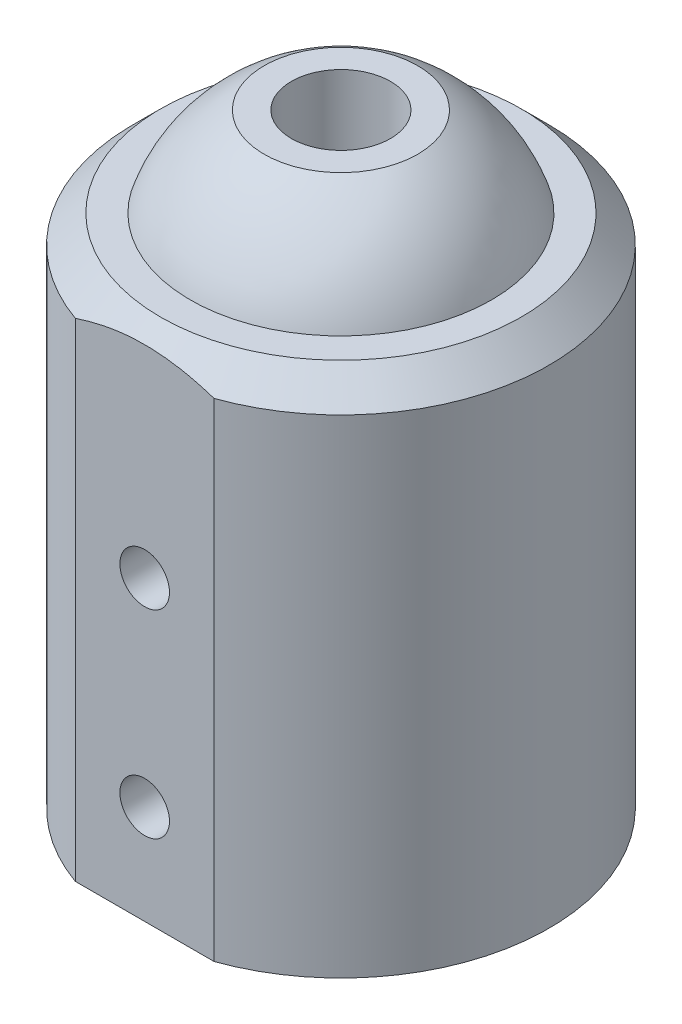
ISO-10303-21;
HEADER;
FILE_DESCRIPTION(('STEP AP214'),'2;1');
FILE_NAME('part.step','',(''),(''),'','','');
FILE_SCHEMA(('AUTOMOTIVE_DESIGN { 1 0 10303 214 1 1 1 1 }'));
ENDSEC;
DATA;
#1=APPLICATION_CONTEXT('core data for automotive mechanical design processes');
#2=APPLICATION_PROTOCOL_DEFINITION('international standard','automotive_design',2000,#1);
#3=PRODUCT_CONTEXT('',#1,'mechanical');
#4=PRODUCT('Part','Part','',(#3));
#5=PRODUCT_RELATED_PRODUCT_CATEGORY('part','',(#4));
#6=PRODUCT_DEFINITION_FORMATION('','',#4);
#7=PRODUCT_DEFINITION_CONTEXT('part definition',#1,'design');
#8=PRODUCT_DEFINITION('design','',#6,#7);
#9=PRODUCT_DEFINITION_SHAPE('','',#8);
#10=(LENGTH_UNIT() NAMED_UNIT(*) SI_UNIT(.MILLI.,.METRE.));
#11=(NAMED_UNIT(*) PLANE_ANGLE_UNIT() SI_UNIT($,.RADIAN.));
#12=(NAMED_UNIT(*) SI_UNIT($,.STERADIAN.) SOLID_ANGLE_UNIT());
#13=UNCERTAINTY_MEASURE_WITH_UNIT(LENGTH_MEASURE(1.E-05),#10,'distance_accuracy_value','');
#14=(GEOMETRIC_REPRESENTATION_CONTEXT(3) GLOBAL_UNCERTAINTY_ASSIGNED_CONTEXT((#13)) GLOBAL_UNIT_ASSIGNED_CONTEXT((#10,
#11,#12)) REPRESENTATION_CONTEXT('',''));
#15=CARTESIAN_POINT('',(0.,0.,0.));
#16=DIRECTION('',(0.,0.,1.));
#17=DIRECTION('',(1.,0.,0.));
#18=AXIS2_PLACEMENT_3D('',#15,#16,#17);
#19=CARTESIAN_POINT('',(0.,33.5828427942722,0.));
#20=DIRECTION('',(0.,1.,0.));
#21=DIRECTION('',(0.,0.,1.));
#22=AXIS2_PLACEMENT_3D('',#19,#20,#21);
#23=CYLINDRICAL_SURFACE('',#22,10.5);
#24=DIRECTION('',(0.,-1.,0.));
#25=VECTOR('',#24,1.);
#26=CARTESIAN_POINT('',(3.4985711369072,45.,9.9));
#27=LINE('',#26,#25);
#28=CARTESIAN_POINT('',(3.4985711369072,24.5993420767853,9.9));
#29=VERTEX_POINT('',#28);
#30=CARTESIAN_POINT('',(3.4985711369072,0.,9.9));
#31=VERTEX_POINT('',#30);
#32=EDGE_CURVE('E61',#29,#31,#27,.T.);
#33=ORIENTED_EDGE('',*,*,#32,.T.);
#34=CARTESIAN_POINT('',(0.,0.,0.));
#35=DIRECTION('',(0.,1.,0.));
#36=DIRECTION('',(0.,0.,1.));
#37=AXIS2_PLACEMENT_3D('',#34,#35,#36);
#38=CIRCLE('',#37,10.5);
#39=CARTESIAN_POINT('',(-3.4985711369072,0.,9.9));
#40=VERTEX_POINT('',#39);
#41=EDGE_CURVE('E76',#31,#40,#38,.T.);
#42=ORIENTED_EDGE('',*,*,#41,.T.);
#43=DIRECTION('',(0.,-1.,0.));
#44=VECTOR('',#43,1.);
#45=CARTESIAN_POINT('',(-3.4985711369072,45.,9.9));
#46=LINE('',#45,#44);
#47=CARTESIAN_POINT('',(-3.4985711369072,24.5993420767853,9.9));
#48=VERTEX_POINT('',#47);
#49=EDGE_CURVE('E56',#48,#40,#46,.T.);
#50=ORIENTED_EDGE('',*,*,#49,.F.);
#51=CARTESIAN_POINT('',(0.,24.5993420767853,0.));
#52=DIRECTION('',(0.,1.,0.));
#53=DIRECTION('',(0.,0.,1.));
#54=AXIS2_PLACEMENT_3D('',#51,#52,#53);
#55=CIRCLE('',#54,10.5);
#56=EDGE_CURVE('E11',#29,#48,#55,.T.);
#57=ORIENTED_EDGE('',*,*,#56,.F.);
#58=EDGE_LOOP('',(#33,#42,#50,#57));
#59=FACE_BOUND('',#58,.T.);
#60=ADVANCED_FACE('F41',(#59),#23,.T.);
#61=CARTESIAN_POINT('',(0.,24.5993420767853,0.));
#62=DIRECTION('',(0.,-1.,0.));
#63=DIRECTION('',(0.,0.,-1.));
#64=AXIS2_PLACEMENT_3D('',#61,#62,#63);
#65=CONICAL_SURFACE('',#64,10.5,0.785398163397453);
#66=CARTESIAN_POINT('',(0.,26.,0.));
#67=DIRECTION('',(0.,1.,0.));
#68=DIRECTION('',(0.,0.,1.));
#69=AXIS2_PLACEMENT_3D('',#66,#67,#68);
#70=CIRCLE('',#69,9.09934207678533);
#71=CARTESIAN_POINT('',(0.,26.,9.09934207678533));
#72=VERTEX_POINT('',#71);
#73=EDGE_CURVE('E49',#72,#72,#70,.T.);
#74=ORIENTED_EDGE('',*,*,#73,.F.);
#75=EDGE_LOOP('',(#74));
#76=FACE_BOUND('',#75,.T.);
#77=CARTESIAN_POINT('',(10.6347253560614,20.5698072115925,9.9));
#78=CARTESIAN_POINT('',(10.3534327245152,20.7756370171556,9.9));
#79=CARTESIAN_POINT('',(10.0703640832947,20.9790886058814,9.9));
#80=CARTESIAN_POINT('',(9.49994449108002,21.3801096104111,9.9));
#81=CARTESIAN_POINT('',(9.21259204206175,21.5776768924951,9.9));
#82=CARTESIAN_POINT('',(8.62992895484494,21.9677607024612,9.9));
#83=CARTESIAN_POINT('',(8.33456578398147,22.1601990946641,9.9));
#84=CARTESIAN_POINT('',(7.73818145145608,22.5360694148431,9.9));
#85=CARTESIAN_POINT('',(7.43716083203955,22.7195021999469,9.9));
#86=CARTESIAN_POINT('',(6.81469406083715,23.0833782446129,9.9));
#87=CARTESIAN_POINT('',(6.49294277694404,23.2633028011417,9.9));
#88=CARTESIAN_POINT('',(5.84122694862456,23.6078923575283,9.9));
#89=CARTESIAN_POINT('',(5.51126082511532,23.7725543943925,9.9));
#90=CARTESIAN_POINT('',(4.8437397246116,24.0818679774736,9.9));
#91=CARTESIAN_POINT('',(4.50622415814122,24.2266037290523,9.9));
#92=CARTESIAN_POINT('',(3.82186202173466,24.4919263438985,9.9));
#93=CARTESIAN_POINT('',(3.47501949477547,24.6125234851075,9.9));
#94=CARTESIAN_POINT('',(2.79385250281583,24.8174746471964,9.9));
#95=CARTESIAN_POINT('',(2.4600683586249,24.9036003087884,9.9));
#96=CARTESIAN_POINT('',(1.78586267617628,25.0449497638404,9.9));
#97=CARTESIAN_POINT('',(1.44544055245254,25.100170818657,9.9));
#98=CARTESIAN_POINT('',(0.766481206723811,25.1753468762649,9.9));
#99=CARTESIAN_POINT('',(0.428009473572112,25.1958825052144,9.9));
#100=CARTESIAN_POINT('',(-0.249245485116191,25.2019946809104,9.9));
#101=CARTESIAN_POINT('',(-0.588028698156881,25.1875725737329,9.9));
#102=CARTESIAN_POINT('',(-1.26129292288764,25.1249357300161,9.9));
#103=CARTESIAN_POINT('',(-1.59578424604384,25.0768294931369,9.9));
#104=CARTESIAN_POINT('',(-2.25889352555743,24.9501283914096,9.9));
#105=CARTESIAN_POINT('',(-2.58751044315523,24.8715281890833,9.9));
#106=CARTESIAN_POINT('',(-3.24258465072016,24.6866622865256,9.9));
#107=CARTESIAN_POINT('',(-3.56891784814667,24.5799634507927,9.9));
#108=CARTESIAN_POINT('',(-4.21331233486015,24.3442499311886,9.9));
#109=CARTESIAN_POINT('',(-4.53137380686518,24.2152357407344,9.9));
#110=CARTESIAN_POINT('',(-5.10960524225863,23.9610401127193,9.9));
#111=CARTESIAN_POINT('',(-5.37095090644008,23.8385006629271,9.9));
#112=CARTESIAN_POINT('',(-5.88838236354608,23.5827256500491,9.9));
#113=CARTESIAN_POINT('',(-6.14446735015625,23.4494884624364,9.9));
#114=CARTESIAN_POINT('',(-6.65207092220755,23.1739673421567,9.9));
#115=CARTESIAN_POINT('',(-6.90358406574976,23.0316734335521,9.9));
#116=CARTESIAN_POINT('',(-7.40224875665219,22.7396315576672,9.9));
#117=CARTESIAN_POINT('',(-7.64940005651858,22.589883169245,9.9));
#118=CARTESIAN_POINT('',(-8.12952153510164,22.290540747204,9.9));
#119=CARTESIAN_POINT('',(-8.36265205312506,22.1412030478821,9.9));
#120=CARTESIAN_POINT('',(-8.82571597270232,21.8376413771605,9.9));
#121=CARTESIAN_POINT('',(-9.05564925485527,21.6834172239775,9.9));
#122=CARTESIAN_POINT('',(-9.5119045120272,21.3713163542598,9.9));
#123=CARTESIAN_POINT('',(-9.73823589395235,21.2134533563395,9.9));
#124=CARTESIAN_POINT('',(-10.1883264619794,20.8941666084075,9.9));
#125=CARTESIAN_POINT('',(-10.4120860106608,20.7327433699254,9.9));
#126=CARTESIAN_POINT('',(-10.6347253560614,20.5698072115925,9.9));
#127=B_SPLINE_CURVE_WITH_KNOTS('',3,(#77,#78,#79,#80,#81,#82,#83,#84,#85,#86,#87,#88,#89,#90,
#91,#92,#93,#94,#95,#96,#97,#98,#99,#100,#101,#102,#103,#104,#105,#106,#107,#108,#109,#110,#111,
#112,#113,#114,#115,#116,#117,#118,#119,#120,#121,#122,#123,#124,#125,#126),.UNSPECIFIED.,.F.,
.F.,(4,2,2,2,2,2,2,2,2,2,2,2,2,2,2,2,2,2,2,2,2,2,2,2,4),(0.,1.04569907568333,2.09177282855905,
3.14920509274946,4.20653651770245,5.3121335945599,6.41794485923903,7.51892944154791,
8.61944423540979,9.65233814197261,10.6853235649965,11.7008391144993,12.7163155613713,
13.728536023536,14.7409337386088,15.7699574429246,16.7989583973096,17.6646310017704,
18.5304353142487,19.3972103881159,20.2640344862624,21.0945455094225,21.9250874651911,
22.7528911838311,23.5805767299358),.UNSPECIFIED.);
#128=EDGE_CURVE('E78',#29,#48,#127,.T.);
#129=ORIENTED_EDGE('',*,*,#128,.F.);
#130=ORIENTED_EDGE('',*,*,#56,.T.);
#131=EDGE_LOOP('',(#129,#130));
#132=FACE_BOUND('',#131,.T.);
#133=ADVANCED_FACE('F103',(#76,#132),#65,.T.);
#134=CARTESIAN_POINT('',(0.,0.,0.));
#135=DIRECTION('',(0.,1.,0.));
#136=DIRECTION('',(0.,0.,1.));
#137=AXIS2_PLACEMENT_3D('',#134,#135,#136);
#138=PLANE('',#137);
#139=DIRECTION('',(-1.,0.,0.));
#140=VECTOR('',#139,1.);
#141=CARTESIAN_POINT('',(-3.4985711369072,0.,9.9));
#142=LINE('',#141,#140);
#143=EDGE_CURVE('E66',#31,#40,#142,.T.);
#144=ORIENTED_EDGE('',*,*,#143,.T.);
#145=ORIENTED_EDGE('',*,*,#41,.F.);
#146=EDGE_LOOP('',(#144,#145));
#147=FACE_BOUND('',#146,.T.);
#148=ADVANCED_FACE('F80',(#147),#138,.F.);
#149=CARTESIAN_POINT('',(9.09934207678533,26.,0.));
#150=DIRECTION('',(0.,-1.,0.));
#151=DIRECTION('',(0.,0.,-1.));
#152=AXIS2_PLACEMENT_3D('',#149,#150,#151);
#153=PLANE('',#152);
#154=CARTESIAN_POINT('',(0.,26.,0.));
#155=DIRECTION('',(0.,1.,0.));
#156=DIRECTION('',(0.,0.,1.));
#157=AXIS2_PLACEMENT_3D('',#154,#155,#156);
#158=CIRCLE('',#157,7.59934207678533);
#159=CARTESIAN_POINT('',(7.59934207678533,26.,0.));
#160=VERTEX_POINT('',#159);
#161=EDGE_CURVE('E88',#160,#160,#158,.T.);
#162=ORIENTED_EDGE('',*,*,#161,.F.);
#163=EDGE_LOOP('',(#162));
#164=FACE_BOUND('',#163,.T.);
#165=ORIENTED_EDGE('',*,*,#73,.T.);
#166=EDGE_LOOP('',(#165));
#167=FACE_BOUND('',#166,.T.);
#168=ADVANCED_FACE('F101',(#164,#167),#153,.F.);
#169=CARTESIAN_POINT('',(0.,23.5,0.));
#170=DIRECTION('',(0.,1.,0.));
#171=DIRECTION('',(1.,0.,0.));
#172=AXIS2_PLACEMENT_3D('',#169,#170,#171);
#173=SPHERICAL_SURFACE('',#172,8.);
#174=CARTESIAN_POINT('',(0.,30.5,0.));
#175=DIRECTION('',(0.,1.,0.));
#176=DIRECTION('',(0.,0.,1.));
#177=AXIS2_PLACEMENT_3D('',#174,#175,#176);
#178=CIRCLE('',#177,3.87298334620741);
#179=CARTESIAN_POINT('',(3.87298334620742,30.5,0.));
#180=VERTEX_POINT('',#179);
#181=EDGE_CURVE('E82',#180,#180,#178,.T.);
#182=CARTESIAN_POINT('',(3.87298334620742,30.5,0.));
#183=CARTESIAN_POINT('',(3.92749680128483,30.4698387767501,0.));
#184=CARTESIAN_POINT('',(3.98165778776365,30.439040516417,0.));
#185=CARTESIAN_POINT('',(4.08924557853226,30.3761872722195,0.));
#186=CARTESIAN_POINT('',(4.14267238282205,30.344132288355,0.));
#187=CARTESIAN_POINT('',(4.24876256422074,30.2787829477297,0.));
#188=CARTESIAN_POINT('',(4.30142594132965,30.2454885909689,0.));
#189=CARTESIAN_POINT('',(4.40596054742428,30.1776787154259,0.));
#190=CARTESIAN_POINT('',(4.45783177641001,30.1431631966439,0.));
#191=CARTESIAN_POINT('',(4.56075376889973,30.0729298251962,0.));
#192=CARTESIAN_POINT('',(4.61180453240373,30.0372119725307,0.));
#193=CARTESIAN_POINT('',(4.71305773208982,29.9645934308825,0.));
#194=CARTESIAN_POINT('',(4.76326016827191,29.9276927418998,0.));
#195=CARTESIAN_POINT('',(4.86278931242486,29.8527286672391,0.));
#196=CARTESIAN_POINT('',(4.91211602039572,29.8146652815611,0.));
#197=CARTESIAN_POINT('',(5.00986678576215,29.7373965886779,0.));
#198=CARTESIAN_POINT('',(5.05829084315772,29.6981912814727,0.));
#199=CARTESIAN_POINT('',(5.15420987752725,29.6186601437094,0.));
#200=CARTESIAN_POINT('',(5.20170485450121,29.5783343131512,0.));
#201=CARTESIAN_POINT('',(5.29573980531233,29.4965841385052,0.));
#202=CARTESIAN_POINT('',(5.3422797791495,29.4551597944172,0.));
#203=CARTESIAN_POINT('',(5.43437932220122,29.3712352020843,0.));
#204=CARTESIAN_POINT('',(5.47993889141577,29.3287349538392,0.));
#205=CARTESIAN_POINT('',(5.57005275884344,29.2426817497974,0.));
#206=CARTESIAN_POINT('',(5.61460705705655,29.1991287940007,0.));
#207=CARTESIAN_POINT('',(5.70268606477789,29.1109939460265,0.));
#208=CARTESIAN_POINT('',(5.74621077428613,29.066412053849,0.));
#209=CARTESIAN_POINT('',(5.83220684884326,28.9762436658775,0.));
#210=CARTESIAN_POINT('',(5.87467821389215,28.9306571700834,0.));
#211=CARTESIAN_POINT('',(5.95854441869071,28.8385044559546,0.));
#212=CARTESIAN_POINT('',(5.99993925844038,28.7919382376198,0.));
#213=CARTESIAN_POINT('',(6.08162981936734,28.6978514942175,0.));
#214=CARTESIAN_POINT('',(6.12192554054463,28.6503309691499,0.));
#215=CARTESIAN_POINT('',(6.20139587095178,28.5543615489495,0.));
#216=CARTESIAN_POINT('',(6.24057048018165,28.5059126538167,0.));
#217=CARTESIAN_POINT('',(6.31777720522098,28.4081129368574,0.));
#218=CARTESIAN_POINT('',(6.35580932103045,28.3587621150309,0.));
#219=CARTESIAN_POINT('',(6.4307103013281,28.2591854803264,0.));
#220=CARTESIAN_POINT('',(6.46757916581627,28.2089596674485,0.));
#221=CARTESIAN_POINT('',(6.54013352047217,28.1076604638529,0.));
#222=CARTESIAN_POINT('',(6.57581901063989,28.0565870731354,0.));
#223=CARTESIAN_POINT('',(6.64598713954046,27.9536205896798,0.));
#224=CARTESIAN_POINT('',(6.6804697782733,27.9017274969418,0.));
#225=CARTESIAN_POINT('',(6.74821338370549,27.7971499326573,0.));
#226=CARTESIAN_POINT('',(6.78147435040484,27.7444654611108,0.));
#227=CARTESIAN_POINT('',(6.84675645795771,27.638333894355,0.));
#228=CARTESIAN_POINT('',(6.87877759881122,27.5848867991456,0.));
#229=CARTESIAN_POINT('',(6.94156257756145,27.4772591564508,0.));
#230=CARTESIAN_POINT('',(6.97232641545816,27.4230786089653,0.));
#231=CARTESIAN_POINT('',(7.03257999739894,27.3140136334158,0.));
#232=CARTESIAN_POINT('',(7.06206974144301,27.2591292053517,0.));
#233=CARTESIAN_POINT('',(7.11975904025639,27.1486864245464,0.));
#234=CARTESIAN_POINT('',(7.14795859502571,27.0931280718051,0.));
#235=CARTESIAN_POINT('',(7.20305212377479,26.9813677652757,0.));
#236=CARTESIAN_POINT('',(7.22994609775455,26.9251658114877,0.));
#237=CARTESIAN_POINT('',(7.28241378702874,26.8121489781397,0.));
#238=CARTESIAN_POINT('',(7.30798750232316,26.7553340985797,0.));
#239=CARTESIAN_POINT('',(7.35780071306823,26.6411224221267,0.));
#240=CARTESIAN_POINT('',(7.38204020851888,26.5837256252336,0.));
#241=CARTESIAN_POINT('',(7.42917176103568,26.468381445277,0.));
#242=CARTESIAN_POINT('',(7.45206381810183,26.4104340622134,0.));
#243=CARTESIAN_POINT('',(7.49648795699265,26.2940203225038,0.));
#244=CARTESIAN_POINT('',(7.51802003881731,26.2355539658577,0.));
#245=CARTESIAN_POINT('',(7.55971263322879,26.1181342460494,0.));
#246=CARTESIAN_POINT('',(7.57987314581561,26.0591808828872,0.));
#247=CARTESIAN_POINT('',(7.59934207678533,26.,0.));
#248=B_SPLINE_CURVE_WITH_KNOTS('',3,(#182,#183,#184,#185,#186,#187,#188,#189,#190,#191,#192,
#193,#194,#195,#196,#197,#198,#199,#200,#201,#202,#203,#204,#205,#206,#207,#208,#209,#210,#211,
#212,#213,#214,#215,#216,#217,#218,#219,#220,#221,#222,#223,#224,#225,#226,#227,#228,#229,#230,
#231,#232,#233,#234,#235,#236,#237,#238,#239,#240,#241,#242,#243,#244,#245,#246,#247),
.UNSPECIFIED.,.F.,.F.,(4,2,2,2,2,2,2,2,2,2,2,2,2,2,2,2,2,2,2,2,2,2,2,2,2,2,2,2,2,2,2,2,4),(0.,
0.186898777500724,0.37379755500145,0.560696332502178,0.747595110002903,0.934493887503631,
1.12139266500436,1.30829144250508,1.49519022000581,1.68208899750654,1.86898777500726,
2.05588655250799,2.24278533000872,2.42968410750944,2.61658288501017,2.8034816625109,
2.99038044001162,3.17727921751235,3.36417799501307,3.5510767725138,3.73797555001453,
3.92487432751525,4.11177310501598,4.29867188251671,4.48557066001743,4.67246943751816,
4.85936821501889,5.04626699251961,5.23316577002034,5.42006454752107,5.60696332502179,
5.79386210252252,5.98076088002324),.UNSPECIFIED.);
#249=EDGE_CURVE('BSEAM138',#180,#160,#248,.T.);
#250=ORIENTED_EDGE('',*,*,#181,.F.);
#251=ORIENTED_EDGE('',*,*,#161,.T.);
#252=ORIENTED_EDGE('',*,*,#249,.T.);
#253=ORIENTED_EDGE('',*,*,#249,.F.);
#254=EDGE_LOOP('',(#250,#252,#251,#253));
#255=FACE_BOUND('',#254,.T.);
#256=ADVANCED_FACE('F138',(#255),#173,.T.);
#257=CARTESIAN_POINT('',(0.,30.5,0.));
#258=DIRECTION('',(0.,-1.,0.));
#259=DIRECTION('',(0.,0.,-1.));
#260=AXIS2_PLACEMENT_3D('',#257,#258,#259);
#261=PLANE('',#260);
#262=CARTESIAN_POINT('',(0.,30.5,0.));
#263=DIRECTION('',(0.,1.,0.));
#264=DIRECTION('',(0.,0.,1.));
#265=AXIS2_PLACEMENT_3D('',#262,#263,#264);
#266=CIRCLE('',#265,2.5);
#267=CARTESIAN_POINT('',(0.,30.5,2.5));
#268=VERTEX_POINT('',#267);
#269=EDGE_CURVE('E91',#268,#268,#266,.T.);
#270=ORIENTED_EDGE('',*,*,#269,.F.);
#271=EDGE_LOOP('',(#270));
#272=FACE_BOUND('',#271,.T.);
#273=ORIENTED_EDGE('',*,*,#181,.T.);
#274=EDGE_LOOP('',(#273));
#275=FACE_BOUND('',#274,.T.);
#276=ADVANCED_FACE('F132',(#272,#275),#261,.F.);
#277=CARTESIAN_POINT('',(0.,25.5,0.));
#278=DIRECTION('',(0.,1.,0.));
#279=DIRECTION('',(0.,0.,1.));
#280=AXIS2_PLACEMENT_3D('',#277,#278,#279);
#281=CYLINDRICAL_SURFACE('',#280,2.5);
#282=CARTESIAN_POINT('',(0.,25.5,0.));
#283=DIRECTION('',(0.,1.,0.));
#284=DIRECTION('',(0.,0.,1.));
#285=AXIS2_PLACEMENT_3D('',#282,#283,#284);
#286=CIRCLE('',#285,2.5);
#287=CARTESIAN_POINT('',(0.,25.5,2.5));
#288=VERTEX_POINT('',#287);
#289=EDGE_CURVE('E83',#288,#288,#286,.T.);
#290=ORIENTED_EDGE('',*,*,#289,.F.);
#291=EDGE_LOOP('',(#290));
#292=FACE_BOUND('',#291,.T.);
#293=ORIENTED_EDGE('',*,*,#269,.T.);
#294=EDGE_LOOP('',(#293));
#295=FACE_BOUND('',#294,.T.);
#296=ADVANCED_FACE('F128',(#292,#295),#281,.F.);
#297=CARTESIAN_POINT('',(0.,25.5,0.));
#298=DIRECTION('',(0.,1.,0.));
#299=DIRECTION('',(0.,0.,1.));
#300=AXIS2_PLACEMENT_3D('',#297,#298,#299);
#301=PLANE('',#300);
#302=ORIENTED_EDGE('',*,*,#289,.T.);
#303=EDGE_LOOP('',(#302));
#304=FACE_BOUND('',#303,.T.);
#305=ADVANCED_FACE('F123',(#304),#301,.T.);
#306=CARTESIAN_POINT('',(-3.4985711369072,45.,9.9));
#307=DIRECTION('',(0.,0.,1.));
#308=DIRECTION('',(1.,0.,0.));
#309=AXIS2_PLACEMENT_3D('',#306,#307,#308);
#310=PLANE('',#309);
#311=CARTESIAN_POINT('',(0.,5.,9.9));
#312=DIRECTION('',(0.,0.,1.));
#313=DIRECTION('',(1.,0.,0.));
#314=AXIS2_PLACEMENT_3D('',#311,#312,#313);
#315=CIRCLE('',#314,1.25);
#316=CARTESIAN_POINT('',(1.25,5.,9.9));
#317=VERTEX_POINT('',#316);
#318=EDGE_CURVE('E210',#317,#317,#315,.T.);
#319=ORIENTED_EDGE('',*,*,#318,.F.);
#320=EDGE_LOOP('',(#319));
#321=FACE_BOUND('',#320,.T.);
#322=CARTESIAN_POINT('',(0.,15.,9.9));
#323=DIRECTION('',(0.,0.,1.));
#324=DIRECTION('',(1.,0.,0.));
#325=AXIS2_PLACEMENT_3D('',#322,#323,#324);
#326=CIRCLE('',#325,1.25);
#327=CARTESIAN_POINT('',(1.25,15.,9.9));
#328=VERTEX_POINT('',#327);
#329=EDGE_CURVE('E220',#328,#328,#326,.T.);
#330=ORIENTED_EDGE('',*,*,#329,.F.);
#331=EDGE_LOOP('',(#330));
#332=FACE_BOUND('',#331,.T.);
#333=ORIENTED_EDGE('',*,*,#128,.T.);
#334=ORIENTED_EDGE('',*,*,#49,.T.);
#335=ORIENTED_EDGE('',*,*,#143,.F.);
#336=ORIENTED_EDGE('',*,*,#32,.F.);
#337=EDGE_LOOP('',(#333,#334,#335,#336));
#338=FACE_BOUND('',#337,.T.);
#339=ADVANCED_FACE('F67',(#321,#332,#338),#310,.T.);
#340=CARTESIAN_POINT('',(0.,15.,-0.100000000000001));
#341=DIRECTION('',(0.,0.,1.));
#342=DIRECTION('',(1.,0.,0.));
#343=AXIS2_PLACEMENT_3D('',#340,#341,#342);
#344=CYLINDRICAL_SURFACE('',#343,1.25);
#345=CARTESIAN_POINT('',(0.,15.,-0.100000000000001));
#346=DIRECTION('',(0.,0.,1.));
#347=DIRECTION('',(1.,0.,0.));
#348=AXIS2_PLACEMENT_3D('',#345,#346,#347);
#349=CIRCLE('',#348,1.25);
#350=CARTESIAN_POINT('',(1.25,15.,-0.100000000000001));
#351=VERTEX_POINT('',#350);
#352=EDGE_CURVE('E214',#351,#351,#349,.T.);
#353=ORIENTED_EDGE('',*,*,#352,.F.);
#354=EDGE_LOOP('',(#353));
#355=FACE_BOUND('',#354,.T.);
#356=ORIENTED_EDGE('',*,*,#329,.T.);
#357=EDGE_LOOP('',(#356));
#358=FACE_BOUND('',#357,.T.);
#359=ADVANCED_FACE('F122',(#355,#358),#344,.F.);
#360=CARTESIAN_POINT('',(0.,15.,-0.100000000000001));
#361=DIRECTION('',(0.,0.,1.));
#362=DIRECTION('',(1.,0.,0.));
#363=AXIS2_PLACEMENT_3D('',#360,#361,#362);
#364=PLANE('',#363);
#365=ORIENTED_EDGE('',*,*,#352,.T.);
#366=EDGE_LOOP('',(#365));
#367=FACE_BOUND('',#366,.T.);
#368=ADVANCED_FACE('F175',(#367),#364,.T.);
#369=CARTESIAN_POINT('',(0.,5.,-0.100000000000001));
#370=DIRECTION('',(0.,0.,1.));
#371=DIRECTION('',(1.,0.,0.));
#372=AXIS2_PLACEMENT_3D('',#369,#370,#371);
#373=CYLINDRICAL_SURFACE('',#372,1.25);
#374=CARTESIAN_POINT('',(0.,5.,-0.100000000000001));
#375=DIRECTION('',(0.,0.,1.));
#376=DIRECTION('',(1.,0.,0.));
#377=AXIS2_PLACEMENT_3D('',#374,#375,#376);
#378=CIRCLE('',#377,1.25);
#379=CARTESIAN_POINT('',(1.25,5.,-0.100000000000001));
#380=VERTEX_POINT('',#379);
#381=EDGE_CURVE('E72',#380,#380,#378,.T.);
#382=ORIENTED_EDGE('',*,*,#381,.F.);
#383=EDGE_LOOP('',(#382));
#384=FACE_BOUND('',#383,.T.);
#385=ORIENTED_EDGE('',*,*,#318,.T.);
#386=EDGE_LOOP('',(#385));
#387=FACE_BOUND('',#386,.T.);
#388=ADVANCED_FACE('F184',(#384,#387),#373,.F.);
#389=CARTESIAN_POINT('',(0.,5.,-0.100000000000001));
#390=DIRECTION('',(0.,0.,1.));
#391=DIRECTION('',(1.,0.,0.));
#392=AXIS2_PLACEMENT_3D('',#389,#390,#391);
#393=PLANE('',#392);
#394=ORIENTED_EDGE('',*,*,#381,.T.);
#395=EDGE_LOOP('',(#394));
#396=FACE_BOUND('',#395,.T.);
#397=ADVANCED_FACE('F193',(#396),#393,.T.);
#398=CLOSED_SHELL('',(#60,#133,#148,#168,#256,#276,#296,#305,#339,#359,#368,#388,#397));
#399=MANIFOLD_SOLID_BREP('B2',#398);
#400=ADVANCED_BREP_SHAPE_REPRESENTATION('',(#18,#399),#14);
#401=SHAPE_DEFINITION_REPRESENTATION(#9,#400);
ENDSEC;
END-ISO-10303-21;
